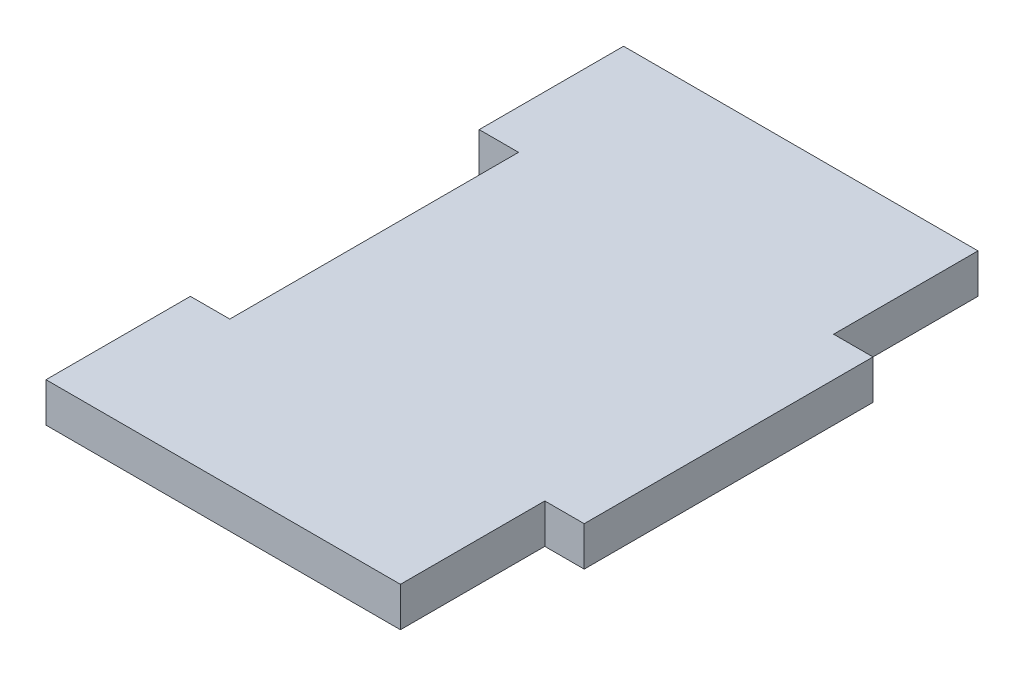
ISO-10303-21;
HEADER;
FILE_DESCRIPTION(('STEP AP214'),'2;1');
FILE_NAME('part.step','',(''),(''),'','','');
FILE_SCHEMA(('AUTOMOTIVE_DESIGN { 1 0 10303 214 1 1 1 1 }'));
ENDSEC;
DATA;
#1=APPLICATION_CONTEXT('core data for automotive mechanical design processes');
#2=APPLICATION_PROTOCOL_DEFINITION('international standard','automotive_design',2000,#1);
#3=PRODUCT_CONTEXT('',#1,'mechanical');
#4=PRODUCT('Part','Part','',(#3));
#5=PRODUCT_RELATED_PRODUCT_CATEGORY('part','',(#4));
#6=PRODUCT_DEFINITION_FORMATION('','',#4);
#7=PRODUCT_DEFINITION_CONTEXT('part definition',#1,'design');
#8=PRODUCT_DEFINITION('design','',#6,#7);
#9=PRODUCT_DEFINITION_SHAPE('','',#8);
#10=(LENGTH_UNIT() NAMED_UNIT(*) SI_UNIT(.MILLI.,.METRE.));
#11=(NAMED_UNIT(*) PLANE_ANGLE_UNIT() SI_UNIT($,.RADIAN.));
#12=(NAMED_UNIT(*) SI_UNIT($,.STERADIAN.) SOLID_ANGLE_UNIT());
#13=UNCERTAINTY_MEASURE_WITH_UNIT(LENGTH_MEASURE(1.E-05),#10,'distance_accuracy_value','');
#14=(GEOMETRIC_REPRESENTATION_CONTEXT(3) GLOBAL_UNCERTAINTY_ASSIGNED_CONTEXT((#13)) GLOBAL_UNIT_ASSIGNED_CONTEXT((#10,
#11,#12)) REPRESENTATION_CONTEXT('',''));
#15=CARTESIAN_POINT('',(0.,0.,0.));
#16=DIRECTION('',(0.,0.,1.));
#17=DIRECTION('',(1.,0.,0.));
#18=AXIS2_PLACEMENT_3D('',#15,#16,#17);
#19=CARTESIAN_POINT('',(0.,3.,0.));
#20=DIRECTION('',(-1.,0.,0.));
#21=DIRECTION('',(0.,0.,1.));
#22=AXIS2_PLACEMENT_3D('',#19,#20,#21);
#23=PLANE('',#22);
#24=DIRECTION('',(0.,0.,-1.));
#25=VECTOR('',#24,1.);
#26=CARTESIAN_POINT('',(0.,0.,0.));
#27=LINE('',#26,#25);
#28=CARTESIAN_POINT('',(0.,0.,-33.));
#29=VERTEX_POINT('',#28);
#30=CARTESIAN_POINT('',(0.,0.,-44.));
#31=VERTEX_POINT('',#30);
#32=EDGE_CURVE('E150',#29,#31,#27,.T.);
#33=ORIENTED_EDGE('',*,*,#32,.F.);
#34=DIRECTION('',(0.,-1.,0.));
#35=VECTOR('',#34,1.);
#36=CARTESIAN_POINT('',(0.,3.,-33.));
#37=LINE('',#36,#35);
#38=CARTESIAN_POINT('',(0.,3.,-33.));
#39=VERTEX_POINT('',#38);
#40=EDGE_CURVE('E11',#39,#29,#37,.T.);
#41=ORIENTED_EDGE('',*,*,#40,.F.);
#42=DIRECTION('',(0.,0.,-1.));
#43=VECTOR('',#42,1.);
#44=CARTESIAN_POINT('',(0.,3.,0.));
#45=LINE('',#44,#43);
#46=CARTESIAN_POINT('',(0.,3.,-44.));
#47=VERTEX_POINT('',#46);
#48=EDGE_CURVE('E180',#39,#47,#45,.T.);
#49=ORIENTED_EDGE('',*,*,#48,.T.);
#50=DIRECTION('',(0.,-1.,0.));
#51=VECTOR('',#50,1.);
#52=CARTESIAN_POINT('',(0.,3.,-44.));
#53=LINE('',#52,#51);
#54=EDGE_CURVE('E96',#47,#31,#53,.T.);
#55=ORIENTED_EDGE('',*,*,#54,.T.);
#56=EDGE_LOOP('',(#33,#41,#49,#55));
#57=FACE_BOUND('',#56,.T.);
#58=ADVANCED_FACE('F33',(#57),#23,.T.);
#59=CARTESIAN_POINT('',(0.,3.,-33.));
#60=DIRECTION('',(0.,0.,1.));
#61=DIRECTION('',(1.,0.,0.));
#62=AXIS2_PLACEMENT_3D('',#59,#60,#61);
#63=PLANE('',#62);
#64=DIRECTION('',(-1.,0.,0.));
#65=VECTOR('',#64,1.);
#66=CARTESIAN_POINT('',(0.,0.,-33.));
#67=LINE('',#66,#65);
#68=CARTESIAN_POINT('',(3.,0.,-33.));
#69=VERTEX_POINT('',#68);
#70=EDGE_CURVE('E153',#69,#29,#67,.T.);
#71=ORIENTED_EDGE('',*,*,#70,.F.);
#72=DIRECTION('',(0.,-1.,0.));
#73=VECTOR('',#72,1.);
#74=CARTESIAN_POINT('',(3.,3.,-33.));
#75=LINE('',#74,#73);
#76=CARTESIAN_POINT('',(3.,3.,-33.));
#77=VERTEX_POINT('',#76);
#78=EDGE_CURVE('E41',#77,#69,#75,.T.);
#79=ORIENTED_EDGE('',*,*,#78,.F.);
#80=DIRECTION('',(-1.,0.,0.));
#81=VECTOR('',#80,1.);
#82=CARTESIAN_POINT('',(0.,3.,-33.));
#83=LINE('',#82,#81);
#84=EDGE_CURVE('E220',#77,#39,#83,.T.);
#85=ORIENTED_EDGE('',*,*,#84,.T.);
#86=ORIENTED_EDGE('',*,*,#40,.T.);
#87=EDGE_LOOP('',(#71,#79,#85,#86));
#88=FACE_BOUND('',#87,.T.);
#89=ADVANCED_FACE('F205',(#88),#63,.T.);
#90=CARTESIAN_POINT('',(3.,3.,0.));
#91=DIRECTION('',(-1.,0.,0.));
#92=DIRECTION('',(0.,0.,1.));
#93=AXIS2_PLACEMENT_3D('',#90,#91,#92);
#94=PLANE('',#93);
#95=DIRECTION('',(0.,0.,-1.));
#96=VECTOR('',#95,1.);
#97=CARTESIAN_POINT('',(3.,0.,0.));
#98=LINE('',#97,#96);
#99=CARTESIAN_POINT('',(3.,0.,-11.));
#100=VERTEX_POINT('',#99);
#101=EDGE_CURVE('E156',#100,#69,#98,.T.);
#102=ORIENTED_EDGE('',*,*,#101,.F.);
#103=DIRECTION('',(0.,-1.,0.));
#104=VECTOR('',#103,1.);
#105=CARTESIAN_POINT('',(3.,3.,-11.));
#106=LINE('',#105,#104);
#107=CARTESIAN_POINT('',(3.,3.,-11.));
#108=VERTEX_POINT('',#107);
#109=EDGE_CURVE('E194',#108,#100,#106,.T.);
#110=ORIENTED_EDGE('',*,*,#109,.F.);
#111=DIRECTION('',(0.,0.,-1.));
#112=VECTOR('',#111,1.);
#113=CARTESIAN_POINT('',(3.,3.,0.));
#114=LINE('',#113,#112);
#115=EDGE_CURVE('E201',#108,#77,#114,.T.);
#116=ORIENTED_EDGE('',*,*,#115,.T.);
#117=ORIENTED_EDGE('',*,*,#78,.T.);
#118=EDGE_LOOP('',(#102,#110,#116,#117));
#119=FACE_BOUND('',#118,.T.);
#120=ADVANCED_FACE('F199',(#119),#94,.T.);
#121=CARTESIAN_POINT('',(0.,3.,-11.));
#122=DIRECTION('',(0.,0.,1.));
#123=DIRECTION('',(1.,0.,0.));
#124=AXIS2_PLACEMENT_3D('',#121,#122,#123);
#125=PLANE('',#124);
#126=DIRECTION('',(-1.,0.,0.));
#127=VECTOR('',#126,1.);
#128=CARTESIAN_POINT('',(0.,0.,-11.));
#129=LINE('',#128,#127);
#130=CARTESIAN_POINT('',(0.,0.,-11.));
#131=VERTEX_POINT('',#130);
#132=EDGE_CURVE('E159',#100,#131,#129,.T.);
#133=ORIENTED_EDGE('',*,*,#132,.T.);
#134=DIRECTION('',(0.,-1.,0.));
#135=VECTOR('',#134,1.);
#136=CARTESIAN_POINT('',(0.,3.,-11.));
#137=LINE('',#136,#135);
#138=CARTESIAN_POINT('',(0.,3.,-11.));
#139=VERTEX_POINT('',#138);
#140=EDGE_CURVE('E192',#139,#131,#137,.T.);
#141=ORIENTED_EDGE('',*,*,#140,.F.);
#142=DIRECTION('',(-1.,0.,0.));
#143=VECTOR('',#142,1.);
#144=CARTESIAN_POINT('',(0.,3.,-11.));
#145=LINE('',#144,#143);
#146=EDGE_CURVE('E216',#108,#139,#145,.T.);
#147=ORIENTED_EDGE('',*,*,#146,.F.);
#148=ORIENTED_EDGE('',*,*,#109,.T.);
#149=EDGE_LOOP('',(#133,#141,#147,#148));
#150=FACE_BOUND('',#149,.T.);
#151=ADVANCED_FACE('F213',(#150),#125,.F.);
#152=CARTESIAN_POINT('',(0.,3.,0.));
#153=DIRECTION('',(-1.,0.,0.));
#154=DIRECTION('',(0.,0.,1.));
#155=AXIS2_PLACEMENT_3D('',#152,#153,#154);
#156=PLANE('',#155);
#157=DIRECTION('',(0.,0.,-1.));
#158=VECTOR('',#157,1.);
#159=CARTESIAN_POINT('',(0.,0.,0.));
#160=LINE('',#159,#158);
#161=CARTESIAN_POINT('',(0.,0.,0.));
#162=VERTEX_POINT('',#161);
#163=EDGE_CURVE('E162',#162,#131,#160,.T.);
#164=ORIENTED_EDGE('',*,*,#163,.F.);
#165=DIRECTION('',(0.,-1.,0.));
#166=VECTOR('',#165,1.);
#167=CARTESIAN_POINT('',(0.,3.,0.));
#168=LINE('',#167,#166);
#169=CARTESIAN_POINT('',(0.,3.,0.));
#170=VERTEX_POINT('',#169);
#171=EDGE_CURVE('E190',#170,#162,#168,.T.);
#172=ORIENTED_EDGE('',*,*,#171,.F.);
#173=DIRECTION('',(0.,0.,-1.));
#174=VECTOR('',#173,1.);
#175=CARTESIAN_POINT('',(0.,3.,0.));
#176=LINE('',#175,#174);
#177=EDGE_CURVE('E218',#170,#139,#176,.T.);
#178=ORIENTED_EDGE('',*,*,#177,.T.);
#179=ORIENTED_EDGE('',*,*,#140,.T.);
#180=EDGE_LOOP('',(#164,#172,#178,#179));
#181=FACE_BOUND('',#180,.T.);
#182=ADVANCED_FACE('F322',(#181),#156,.T.);
#183=CARTESIAN_POINT('',(0.,3.,0.));
#184=DIRECTION('',(0.,0.,-1.));
#185=DIRECTION('',(-1.,0.,0.));
#186=AXIS2_PLACEMENT_3D('',#183,#184,#185);
#187=PLANE('',#186);
#188=DIRECTION('',(1.,0.,0.));
#189=VECTOR('',#188,1.);
#190=CARTESIAN_POINT('',(0.,0.,0.));
#191=LINE('',#190,#189);
#192=CARTESIAN_POINT('',(27.,0.,0.));
#193=VERTEX_POINT('',#192);
#194=EDGE_CURVE('E165',#162,#193,#191,.T.);
#195=ORIENTED_EDGE('',*,*,#194,.T.);
#196=DIRECTION('',(0.,-1.,0.));
#197=VECTOR('',#196,1.);
#198=CARTESIAN_POINT('',(27.,3.,0.));
#199=LINE('',#198,#197);
#200=CARTESIAN_POINT('',(27.,3.,0.));
#201=VERTEX_POINT('',#200);
#202=EDGE_CURVE('E188',#201,#193,#199,.T.);
#203=ORIENTED_EDGE('',*,*,#202,.F.);
#204=DIRECTION('',(1.,0.,0.));
#205=VECTOR('',#204,1.);
#206=CARTESIAN_POINT('',(0.,3.,0.));
#207=LINE('',#206,#205);
#208=EDGE_CURVE('E226',#170,#201,#207,.T.);
#209=ORIENTED_EDGE('',*,*,#208,.F.);
#210=ORIENTED_EDGE('',*,*,#171,.T.);
#211=EDGE_LOOP('',(#195,#203,#209,#210));
#212=FACE_BOUND('',#211,.T.);
#213=ADVANCED_FACE('F313',(#212),#187,.F.);
#214=CARTESIAN_POINT('',(27.,3.,0.));
#215=DIRECTION('',(1.,0.,0.));
#216=DIRECTION('',(0.,0.,-1.));
#217=AXIS2_PLACEMENT_3D('',#214,#215,#216);
#218=PLANE('',#217);
#219=DIRECTION('',(0.,0.,1.));
#220=VECTOR('',#219,1.);
#221=CARTESIAN_POINT('',(27.,0.,0.));
#222=LINE('',#221,#220);
#223=CARTESIAN_POINT('',(27.,0.,-11.));
#224=VERTEX_POINT('',#223);
#225=EDGE_CURVE('E168',#224,#193,#222,.T.);
#226=ORIENTED_EDGE('',*,*,#225,.F.);
#227=DIRECTION('',(0.,-1.,0.));
#228=VECTOR('',#227,1.);
#229=CARTESIAN_POINT('',(27.,3.,-11.));
#230=LINE('',#229,#228);
#231=CARTESIAN_POINT('',(27.,3.,-11.));
#232=VERTEX_POINT('',#231);
#233=EDGE_CURVE('E186',#232,#224,#230,.T.);
#234=ORIENTED_EDGE('',*,*,#233,.F.);
#235=DIRECTION('',(0.,0.,1.));
#236=VECTOR('',#235,1.);
#237=CARTESIAN_POINT('',(27.,3.,0.));
#238=LINE('',#237,#236);
#239=EDGE_CURVE('E228',#232,#201,#238,.T.);
#240=ORIENTED_EDGE('',*,*,#239,.T.);
#241=ORIENTED_EDGE('',*,*,#202,.T.);
#242=EDGE_LOOP('',(#226,#234,#240,#241));
#243=FACE_BOUND('',#242,.T.);
#244=ADVANCED_FACE('F241',(#243),#218,.T.);
#245=CARTESIAN_POINT('',(0.,3.,-11.));
#246=DIRECTION('',(0.,0.,1.));
#247=DIRECTION('',(1.,0.,0.));
#248=AXIS2_PLACEMENT_3D('',#245,#246,#247);
#249=PLANE('',#248);
#250=DIRECTION('',(-1.,0.,0.));
#251=VECTOR('',#250,1.);
#252=CARTESIAN_POINT('',(0.,0.,-11.));
#253=LINE('',#252,#251);
#254=CARTESIAN_POINT('',(30.,0.,-11.));
#255=VERTEX_POINT('',#254);
#256=EDGE_CURVE('E171',#255,#224,#253,.T.);
#257=ORIENTED_EDGE('',*,*,#256,.F.);
#258=DIRECTION('',(0.,-1.,0.));
#259=VECTOR('',#258,1.);
#260=CARTESIAN_POINT('',(30.,3.,-11.));
#261=LINE('',#260,#259);
#262=CARTESIAN_POINT('',(30.,3.,-11.));
#263=VERTEX_POINT('',#262);
#264=EDGE_CURVE('E184',#263,#255,#261,.T.);
#265=ORIENTED_EDGE('',*,*,#264,.F.);
#266=DIRECTION('',(-1.,0.,0.));
#267=VECTOR('',#266,1.);
#268=CARTESIAN_POINT('',(0.,3.,-11.));
#269=LINE('',#268,#267);
#270=EDGE_CURVE('E231',#263,#232,#269,.T.);
#271=ORIENTED_EDGE('',*,*,#270,.T.);
#272=ORIENTED_EDGE('',*,*,#233,.T.);
#273=EDGE_LOOP('',(#257,#265,#271,#272));
#274=FACE_BOUND('',#273,.T.);
#275=ADVANCED_FACE('F235',(#274),#249,.T.);
#276=CARTESIAN_POINT('',(30.,3.,0.));
#277=DIRECTION('',(-1.,0.,0.));
#278=DIRECTION('',(0.,0.,1.));
#279=AXIS2_PLACEMENT_3D('',#276,#277,#278);
#280=PLANE('',#279);
#281=DIRECTION('',(0.,0.,-1.));
#282=VECTOR('',#281,1.);
#283=CARTESIAN_POINT('',(30.,0.,0.));
#284=LINE('',#283,#282);
#285=CARTESIAN_POINT('',(30.,0.,-33.));
#286=VERTEX_POINT('',#285);
#287=EDGE_CURVE('E174',#255,#286,#284,.T.);
#288=ORIENTED_EDGE('',*,*,#287,.T.);
#289=DIRECTION('',(0.,-1.,0.));
#290=VECTOR('',#289,1.);
#291=CARTESIAN_POINT('',(30.,3.,-33.));
#292=LINE('',#291,#290);
#293=CARTESIAN_POINT('',(30.,3.,-33.));
#294=VERTEX_POINT('',#293);
#295=EDGE_CURVE('E142',#294,#286,#292,.T.);
#296=ORIENTED_EDGE('',*,*,#295,.F.);
#297=DIRECTION('',(0.,0.,-1.));
#298=VECTOR('',#297,1.);
#299=CARTESIAN_POINT('',(30.,3.,0.));
#300=LINE('',#299,#298);
#301=EDGE_CURVE('E133',#263,#294,#300,.T.);
#302=ORIENTED_EDGE('',*,*,#301,.F.);
#303=ORIENTED_EDGE('',*,*,#264,.T.);
#304=EDGE_LOOP('',(#288,#296,#302,#303));
#305=FACE_BOUND('',#304,.T.);
#306=ADVANCED_FACE('F244',(#305),#280,.F.);
#307=CARTESIAN_POINT('',(0.,3.,-33.));
#308=DIRECTION('',(0.,0.,1.));
#309=DIRECTION('',(1.,0.,0.));
#310=AXIS2_PLACEMENT_3D('',#307,#308,#309);
#311=PLANE('',#310);
#312=DIRECTION('',(-1.,0.,0.));
#313=VECTOR('',#312,1.);
#314=CARTESIAN_POINT('',(0.,0.,-33.));
#315=LINE('',#314,#313);
#316=CARTESIAN_POINT('',(27.,0.,-33.));
#317=VERTEX_POINT('',#316);
#318=EDGE_CURVE('E141',#286,#317,#315,.T.);
#319=ORIENTED_EDGE('',*,*,#318,.T.);
#320=DIRECTION('',(0.,-1.,0.));
#321=VECTOR('',#320,1.);
#322=CARTESIAN_POINT('',(27.,3.,-33.));
#323=LINE('',#322,#321);
#324=CARTESIAN_POINT('',(27.,3.,-33.));
#325=VERTEX_POINT('',#324);
#326=EDGE_CURVE('E138',#325,#317,#323,.T.);
#327=ORIENTED_EDGE('',*,*,#326,.F.);
#328=DIRECTION('',(-1.,0.,0.));
#329=VECTOR('',#328,1.);
#330=CARTESIAN_POINT('',(0.,3.,-33.));
#331=LINE('',#330,#329);
#332=EDGE_CURVE('E126',#294,#325,#331,.T.);
#333=ORIENTED_EDGE('',*,*,#332,.F.);
#334=ORIENTED_EDGE('',*,*,#295,.T.);
#335=EDGE_LOOP('',(#319,#327,#333,#334));
#336=FACE_BOUND('',#335,.T.);
#337=ADVANCED_FACE('F139',(#336),#311,.F.);
#338=CARTESIAN_POINT('',(27.,3.,0.));
#339=DIRECTION('',(-1.,0.,0.));
#340=DIRECTION('',(0.,0.,1.));
#341=AXIS2_PLACEMENT_3D('',#338,#339,#340);
#342=PLANE('',#341);
#343=DIRECTION('',(0.,0.,-1.));
#344=VECTOR('',#343,1.);
#345=CARTESIAN_POINT('',(27.,0.,0.));
#346=LINE('',#345,#344);
#347=CARTESIAN_POINT('',(27.,0.,-44.));
#348=VERTEX_POINT('',#347);
#349=EDGE_CURVE('E89',#317,#348,#346,.T.);
#350=ORIENTED_EDGE('',*,*,#349,.T.);
#351=DIRECTION('',(0.,-1.,0.));
#352=VECTOR('',#351,1.);
#353=CARTESIAN_POINT('',(27.,3.,-44.));
#354=LINE('',#353,#352);
#355=CARTESIAN_POINT('',(27.,3.,-44.));
#356=VERTEX_POINT('',#355);
#357=EDGE_CURVE('E143',#356,#348,#354,.T.);
#358=ORIENTED_EDGE('',*,*,#357,.F.);
#359=DIRECTION('',(0.,0.,-1.));
#360=VECTOR('',#359,1.);
#361=CARTESIAN_POINT('',(27.,3.,0.));
#362=LINE('',#361,#360);
#363=EDGE_CURVE('E130',#325,#356,#362,.T.);
#364=ORIENTED_EDGE('',*,*,#363,.F.);
#365=ORIENTED_EDGE('',*,*,#326,.T.);
#366=EDGE_LOOP('',(#350,#358,#364,#365));
#367=FACE_BOUND('',#366,.T.);
#368=ADVANCED_FACE('F145',(#367),#342,.F.);
#369=CARTESIAN_POINT('',(0.,3.,-44.));
#370=DIRECTION('',(0.,0.,1.));
#371=DIRECTION('',(1.,0.,0.));
#372=AXIS2_PLACEMENT_3D('',#369,#370,#371);
#373=PLANE('',#372);
#374=DIRECTION('',(-1.,0.,0.));
#375=VECTOR('',#374,1.);
#376=CARTESIAN_POINT('',(0.,0.,-44.));
#377=LINE('',#376,#375);
#378=EDGE_CURVE('E178',#348,#31,#377,.T.);
#379=ORIENTED_EDGE('',*,*,#378,.T.);
#380=ORIENTED_EDGE('',*,*,#54,.F.);
#381=DIRECTION('',(-1.,0.,0.));
#382=VECTOR('',#381,1.);
#383=CARTESIAN_POINT('',(0.,3.,-44.));
#384=LINE('',#383,#382);
#385=EDGE_CURVE('E49',#356,#47,#384,.T.);
#386=ORIENTED_EDGE('',*,*,#385,.F.);
#387=ORIENTED_EDGE('',*,*,#357,.T.);
#388=EDGE_LOOP('',(#379,#380,#386,#387));
#389=FACE_BOUND('',#388,.T.);
#390=ADVANCED_FACE('F259',(#389),#373,.F.);
#391=CARTESIAN_POINT('',(0.,3.,0.));
#392=DIRECTION('',(0.,1.,0.));
#393=DIRECTION('',(0.,0.,1.));
#394=AXIS2_PLACEMENT_3D('',#391,#392,#393);
#395=PLANE('',#394);
#396=ORIENTED_EDGE('',*,*,#48,.F.);
#397=ORIENTED_EDGE('',*,*,#84,.F.);
#398=ORIENTED_EDGE('',*,*,#115,.F.);
#399=ORIENTED_EDGE('',*,*,#146,.T.);
#400=ORIENTED_EDGE('',*,*,#177,.F.);
#401=ORIENTED_EDGE('',*,*,#208,.T.);
#402=ORIENTED_EDGE('',*,*,#239,.F.);
#403=ORIENTED_EDGE('',*,*,#270,.F.);
#404=ORIENTED_EDGE('',*,*,#301,.T.);
#405=ORIENTED_EDGE('',*,*,#332,.T.);
#406=ORIENTED_EDGE('',*,*,#363,.T.);
#407=ORIENTED_EDGE('',*,*,#385,.T.);
#408=EDGE_LOOP('',(#396,#397,#398,#399,#400,#401,#402,#403,#404,#405,#406,#407));
#409=FACE_BOUND('',#408,.T.);
#410=ADVANCED_FACE('F128',(#409),#395,.T.);
#411=CARTESIAN_POINT('',(0.,0.,0.));
#412=DIRECTION('',(0.,1.,0.));
#413=DIRECTION('',(0.,0.,1.));
#414=AXIS2_PLACEMENT_3D('',#411,#412,#413);
#415=PLANE('',#414);
#416=ORIENTED_EDGE('',*,*,#32,.T.);
#417=ORIENTED_EDGE('',*,*,#378,.F.);
#418=ORIENTED_EDGE('',*,*,#349,.F.);
#419=ORIENTED_EDGE('',*,*,#318,.F.);
#420=ORIENTED_EDGE('',*,*,#287,.F.);
#421=ORIENTED_EDGE('',*,*,#256,.T.);
#422=ORIENTED_EDGE('',*,*,#225,.T.);
#423=ORIENTED_EDGE('',*,*,#194,.F.);
#424=ORIENTED_EDGE('',*,*,#163,.T.);
#425=ORIENTED_EDGE('',*,*,#132,.F.);
#426=ORIENTED_EDGE('',*,*,#101,.T.);
#427=ORIENTED_EDGE('',*,*,#70,.T.);
#428=EDGE_LOOP('',(#416,#417,#418,#419,#420,#421,#422,#423,#424,#425,#426,#427));
#429=FACE_BOUND('',#428,.T.);
#430=ADVANCED_FACE('F208',(#429),#415,.F.);
#431=CLOSED_SHELL('',(#58,#89,#120,#151,#182,#213,#244,#275,#306,#337,#368,#390,#410,#430));
#432=MANIFOLD_SOLID_BREP('B2',#431);
#433=ADVANCED_BREP_SHAPE_REPRESENTATION('',(#18,#432),#14);
#434=SHAPE_DEFINITION_REPRESENTATION(#9,#433);
ENDSEC;
END-ISO-10303-21;
